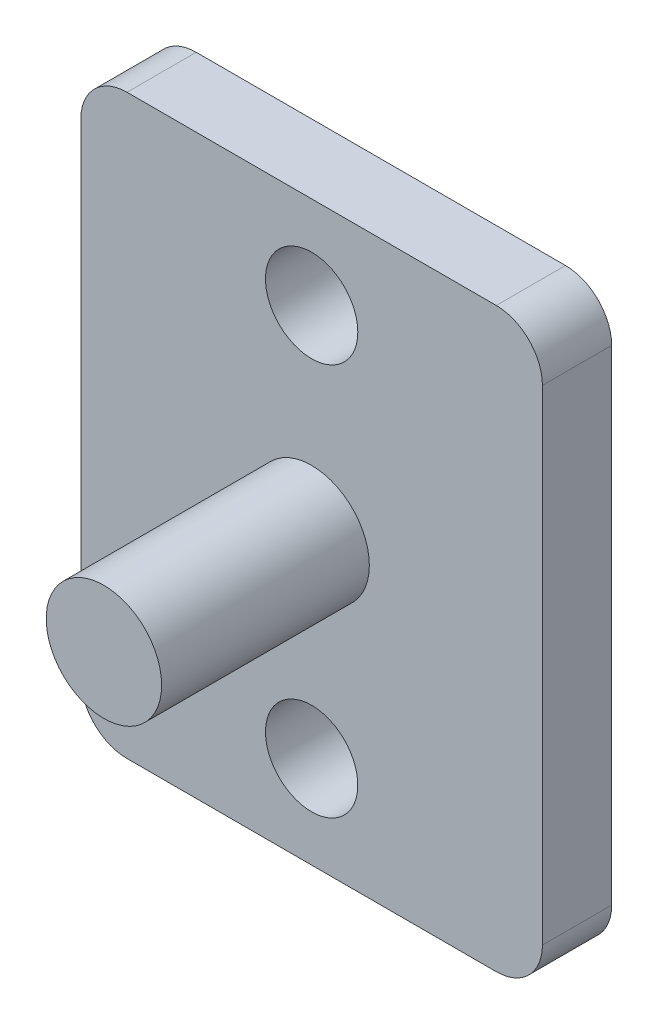
ISO-10303-21;
HEADER;
FILE_DESCRIPTION(('STEP AP214'),'2;1');
FILE_NAME('part.step','',(''),(''),'','','');
FILE_SCHEMA(('AUTOMOTIVE_DESIGN { 1 0 10303 214 1 1 1 1 }'));
ENDSEC;
DATA;
#1=APPLICATION_CONTEXT('core data for automotive mechanical design processes');
#2=APPLICATION_PROTOCOL_DEFINITION('international standard','automotive_design',2000,#1);
#3=PRODUCT_CONTEXT('',#1,'mechanical');
#4=PRODUCT('Part','Part','',(#3));
#5=PRODUCT_RELATED_PRODUCT_CATEGORY('part','',(#4));
#6=PRODUCT_DEFINITION_FORMATION('','',#4);
#7=PRODUCT_DEFINITION_CONTEXT('part definition',#1,'design');
#8=PRODUCT_DEFINITION('design','',#6,#7);
#9=PRODUCT_DEFINITION_SHAPE('','',#8);
#10=(LENGTH_UNIT() NAMED_UNIT(*) SI_UNIT(.MILLI.,.METRE.));
#11=(NAMED_UNIT(*) PLANE_ANGLE_UNIT() SI_UNIT($,.RADIAN.));
#12=(NAMED_UNIT(*) SI_UNIT($,.STERADIAN.) SOLID_ANGLE_UNIT());
#13=UNCERTAINTY_MEASURE_WITH_UNIT(LENGTH_MEASURE(1.E-05),#10,'distance_accuracy_value','');
#14=(GEOMETRIC_REPRESENTATION_CONTEXT(3) GLOBAL_UNCERTAINTY_ASSIGNED_CONTEXT((#13)) GLOBAL_UNIT_ASSIGNED_CONTEXT((#10,
#11,#12)) REPRESENTATION_CONTEXT('',''));
#15=CARTESIAN_POINT('',(0.,0.,0.));
#16=DIRECTION('',(0.,0.,1.));
#17=DIRECTION('',(1.,0.,0.));
#18=AXIS2_PLACEMENT_3D('',#15,#16,#17);
#19=CARTESIAN_POINT('',(0.,0.,3.));
#20=DIRECTION('',(0.,0.,1.));
#21=DIRECTION('',(1.,0.,0.));
#22=AXIS2_PLACEMENT_3D('',#19,#20,#21);
#23=PLANE('',#22);
#24=CARTESIAN_POINT('',(0.,0.,3.));
#25=DIRECTION('',(0.,0.,1.));
#26=DIRECTION('',(1.,0.,0.));
#27=AXIS2_PLACEMENT_3D('',#24,#25,#26);
#28=CIRCLE('',#27,2.5);
#29=CARTESIAN_POINT('',(2.5,0.,3.));
#30=VERTEX_POINT('',#29);
#31=EDGE_CURVE('E189',#30,#30,#28,.T.);
#32=ORIENTED_EDGE('',*,*,#31,.F.);
#33=EDGE_LOOP('',(#32));
#34=FACE_BOUND('',#33,.T.);
#35=CARTESIAN_POINT('',(0.,8.5,3.));
#36=DIRECTION('',(0.,0.,1.));
#37=DIRECTION('',(1.,0.,0.));
#38=AXIS2_PLACEMENT_3D('',#35,#36,#37);
#39=CIRCLE('',#38,2.);
#40=CARTESIAN_POINT('',(2.,8.5,3.));
#41=VERTEX_POINT('',#40);
#42=EDGE_CURVE('E132',#41,#41,#39,.T.);
#43=ORIENTED_EDGE('',*,*,#42,.F.);
#44=EDGE_LOOP('',(#43));
#45=FACE_BOUND('',#44,.T.);
#46=DIRECTION('',(0.,-1.,0.));
#47=VECTOR('',#46,1.);
#48=CARTESIAN_POINT('',(-10.,-12.5,3.));
#49=LINE('',#48,#47);
#50=CARTESIAN_POINT('',(-10.,10.5,3.));
#51=VERTEX_POINT('',#50);
#52=CARTESIAN_POINT('',(-10.,-10.5,3.));
#53=VERTEX_POINT('',#52);
#54=EDGE_CURVE('E137',#51,#53,#49,.T.);
#55=ORIENTED_EDGE('',*,*,#54,.T.);
#56=CARTESIAN_POINT('',(-8.,-10.5,3.));
#57=DIRECTION('',(0.,0.,1.));
#58=DIRECTION('',(1.,0.,0.));
#59=AXIS2_PLACEMENT_3D('',#56,#57,#58);
#60=CIRCLE('',#59,2.);
#61=CARTESIAN_POINT('',(-8.,-12.5,3.));
#62=VERTEX_POINT('',#61);
#63=EDGE_CURVE('E152',#53,#62,#60,.T.);
#64=ORIENTED_EDGE('',*,*,#63,.T.);
#65=DIRECTION('',(1.,0.,0.));
#66=VECTOR('',#65,1.);
#67=CARTESIAN_POINT('',(10.,-12.5,3.));
#68=LINE('',#67,#66);
#69=CARTESIAN_POINT('',(8.,-12.5,3.));
#70=VERTEX_POINT('',#69);
#71=EDGE_CURVE('E119',#62,#70,#68,.T.);
#72=ORIENTED_EDGE('',*,*,#71,.T.);
#73=CARTESIAN_POINT('',(8.,-10.5,3.));
#74=DIRECTION('',(0.,0.,1.));
#75=DIRECTION('',(1.,0.,0.));
#76=AXIS2_PLACEMENT_3D('',#73,#74,#75);
#77=CIRCLE('',#76,2.);
#78=CARTESIAN_POINT('',(10.,-10.5,3.));
#79=VERTEX_POINT('',#78);
#80=EDGE_CURVE('E150',#70,#79,#77,.T.);
#81=ORIENTED_EDGE('',*,*,#80,.T.);
#82=DIRECTION('',(0.,1.,0.));
#83=VECTOR('',#82,1.);
#84=CARTESIAN_POINT('',(10.,-12.5,3.));
#85=LINE('',#84,#83);
#86=CARTESIAN_POINT('',(10.,10.5,3.));
#87=VERTEX_POINT('',#86);
#88=EDGE_CURVE('E163',#79,#87,#85,.T.);
#89=ORIENTED_EDGE('',*,*,#88,.T.);
#90=CARTESIAN_POINT('',(8.,10.5,3.));
#91=DIRECTION('',(0.,0.,1.));
#92=DIRECTION('',(1.,0.,0.));
#93=AXIS2_PLACEMENT_3D('',#90,#91,#92);
#94=CIRCLE('',#93,2.);
#95=CARTESIAN_POINT('',(8.,12.5,3.));
#96=VERTEX_POINT('',#95);
#97=EDGE_CURVE('E54',#87,#96,#94,.T.);
#98=ORIENTED_EDGE('',*,*,#97,.T.);
#99=DIRECTION('',(-1.,0.,0.));
#100=VECTOR('',#99,1.);
#101=CARTESIAN_POINT('',(10.,12.5,3.));
#102=LINE('',#101,#100);
#103=CARTESIAN_POINT('',(-8.,12.5,3.));
#104=VERTEX_POINT('',#103);
#105=EDGE_CURVE('E138',#96,#104,#102,.T.);
#106=ORIENTED_EDGE('',*,*,#105,.T.);
#107=CARTESIAN_POINT('',(-8.,10.5,3.));
#108=DIRECTION('',(0.,0.,1.));
#109=DIRECTION('',(1.,0.,0.));
#110=AXIS2_PLACEMENT_3D('',#107,#108,#109);
#111=CIRCLE('',#110,2.);
#112=EDGE_CURVE('E147',#104,#51,#111,.T.);
#113=ORIENTED_EDGE('',*,*,#112,.T.);
#114=EDGE_LOOP('',(#55,#64,#72,#81,#89,#98,#106,#113));
#115=FACE_BOUND('',#114,.T.);
#116=CARTESIAN_POINT('',(0.,-8.5,3.));
#117=DIRECTION('',(0.,0.,1.));
#118=DIRECTION('',(-1.,0.,0.));
#119=AXIS2_PLACEMENT_3D('',#116,#117,#118);
#120=CIRCLE('',#119,2.);
#121=CARTESIAN_POINT('',(-2.,-8.5,3.));
#122=VERTEX_POINT('',#121);
#123=EDGE_CURVE('E180',#122,#122,#120,.T.);
#124=ORIENTED_EDGE('',*,*,#123,.F.);
#125=EDGE_LOOP('',(#124));
#126=FACE_BOUND('',#125,.T.);
#127=ADVANCED_FACE('F33',(#34,#45,#115,#126),#23,.T.);
#128=CARTESIAN_POINT('',(0.,0.,0.));
#129=DIRECTION('',(0.,0.,1.));
#130=DIRECTION('',(1.,0.,0.));
#131=AXIS2_PLACEMENT_3D('',#128,#129,#130);
#132=PLANE('',#131);
#133=DIRECTION('',(1.,0.,0.));
#134=VECTOR('',#133,1.);
#135=CARTESIAN_POINT('',(10.,-12.5,0.));
#136=LINE('',#135,#134);
#137=CARTESIAN_POINT('',(-8.,-12.5,0.));
#138=VERTEX_POINT('',#137);
#139=CARTESIAN_POINT('',(8.,-12.5,0.));
#140=VERTEX_POINT('',#139);
#141=EDGE_CURVE('E116',#138,#140,#136,.T.);
#142=ORIENTED_EDGE('',*,*,#141,.F.);
#143=CARTESIAN_POINT('',(-8.,-10.5,0.));
#144=DIRECTION('',(0.,0.,1.));
#145=DIRECTION('',(1.,0.,0.));
#146=AXIS2_PLACEMENT_3D('',#143,#144,#145);
#147=CIRCLE('',#146,2.);
#148=CARTESIAN_POINT('',(-10.,-10.5,0.));
#149=VERTEX_POINT('',#148);
#150=EDGE_CURVE('E99',#138,#149,#147,.F.);
#151=ORIENTED_EDGE('',*,*,#150,.T.);
#152=DIRECTION('',(0.,-1.,0.));
#153=VECTOR('',#152,1.);
#154=CARTESIAN_POINT('',(-10.,-12.5,0.));
#155=LINE('',#154,#153);
#156=CARTESIAN_POINT('',(-10.,10.5,0.));
#157=VERTEX_POINT('',#156);
#158=EDGE_CURVE('E127',#157,#149,#155,.T.);
#159=ORIENTED_EDGE('',*,*,#158,.F.);
#160=CARTESIAN_POINT('',(-8.,10.5,0.));
#161=DIRECTION('',(0.,0.,1.));
#162=DIRECTION('',(1.,0.,0.));
#163=AXIS2_PLACEMENT_3D('',#160,#161,#162);
#164=CIRCLE('',#163,2.);
#165=CARTESIAN_POINT('',(-8.,12.5,0.));
#166=VERTEX_POINT('',#165);
#167=EDGE_CURVE('E120',#157,#166,#164,.F.);
#168=ORIENTED_EDGE('',*,*,#167,.T.);
#169=DIRECTION('',(-1.,0.,0.));
#170=VECTOR('',#169,1.);
#171=CARTESIAN_POINT('',(10.,12.5,0.));
#172=LINE('',#171,#170);
#173=CARTESIAN_POINT('',(8.,12.5,0.));
#174=VERTEX_POINT('',#173);
#175=EDGE_CURVE('E130',#174,#166,#172,.T.);
#176=ORIENTED_EDGE('',*,*,#175,.F.);
#177=CARTESIAN_POINT('',(8.,10.5,0.));
#178=DIRECTION('',(0.,0.,1.));
#179=DIRECTION('',(1.,0.,0.));
#180=AXIS2_PLACEMENT_3D('',#177,#178,#179);
#181=CIRCLE('',#180,2.);
#182=CARTESIAN_POINT('',(10.,10.5,0.));
#183=VERTEX_POINT('',#182);
#184=EDGE_CURVE('E141',#174,#183,#181,.F.);
#185=ORIENTED_EDGE('',*,*,#184,.T.);
#186=DIRECTION('',(0.,1.,0.));
#187=VECTOR('',#186,1.);
#188=CARTESIAN_POINT('',(10.,-12.5,0.));
#189=LINE('',#188,#187);
#190=CARTESIAN_POINT('',(10.,-10.5,0.));
#191=VERTEX_POINT('',#190);
#192=EDGE_CURVE('E126',#191,#183,#189,.T.);
#193=ORIENTED_EDGE('',*,*,#192,.F.);
#194=CARTESIAN_POINT('',(8.,-10.5,0.));
#195=DIRECTION('',(0.,0.,1.));
#196=DIRECTION('',(1.,0.,0.));
#197=AXIS2_PLACEMENT_3D('',#194,#195,#196);
#198=CIRCLE('',#197,2.);
#199=EDGE_CURVE('E110',#191,#140,#198,.F.);
#200=ORIENTED_EDGE('',*,*,#199,.T.);
#201=EDGE_LOOP('',(#142,#151,#159,#168,#176,#185,#193,#200));
#202=FACE_BOUND('',#201,.T.);
#203=CARTESIAN_POINT('',(0.,8.5,0.));
#204=DIRECTION('',(0.,0.,1.));
#205=DIRECTION('',(1.,0.,0.));
#206=AXIS2_PLACEMENT_3D('',#203,#204,#205);
#207=CIRCLE('',#206,2.);
#208=CARTESIAN_POINT('',(2.,8.5,0.));
#209=VERTEX_POINT('',#208);
#210=EDGE_CURVE('E177',#209,#209,#207,.T.);
#211=ORIENTED_EDGE('',*,*,#210,.T.);
#212=EDGE_LOOP('',(#211));
#213=FACE_BOUND('',#212,.T.);
#214=CARTESIAN_POINT('',(0.,-8.5,0.));
#215=DIRECTION('',(0.,0.,1.));
#216=DIRECTION('',(-1.,0.,0.));
#217=AXIS2_PLACEMENT_3D('',#214,#215,#216);
#218=CIRCLE('',#217,2.);
#219=CARTESIAN_POINT('',(-2.,-8.5,0.));
#220=VERTEX_POINT('',#219);
#221=EDGE_CURVE('E183',#220,#220,#218,.T.);
#222=ORIENTED_EDGE('',*,*,#221,.T.);
#223=EDGE_LOOP('',(#222));
#224=FACE_BOUND('',#223,.T.);
#225=ADVANCED_FACE('F123',(#202,#213,#224),#132,.F.);
#226=CARTESIAN_POINT('',(-10.,-12.5,3.));
#227=DIRECTION('',(1.,0.,0.));
#228=DIRECTION('',(0.,0.,-1.));
#229=AXIS2_PLACEMENT_3D('',#226,#227,#228);
#230=PLANE('',#229);
#231=ORIENTED_EDGE('',*,*,#158,.T.);
#232=DIRECTION('',(0.,0.,-1.));
#233=VECTOR('',#232,1.);
#234=CARTESIAN_POINT('',(-10.,-10.5,3.));
#235=LINE('',#234,#233);
#236=EDGE_CURVE('E104',#149,#53,#235,.F.);
#237=ORIENTED_EDGE('',*,*,#236,.T.);
#238=ORIENTED_EDGE('',*,*,#54,.F.);
#239=DIRECTION('',(0.,0.,-1.));
#240=VECTOR('',#239,1.);
#241=CARTESIAN_POINT('',(-10.,10.5,3.));
#242=LINE('',#241,#240);
#243=EDGE_CURVE('E109',#51,#157,#242,.T.);
#244=ORIENTED_EDGE('',*,*,#243,.T.);
#245=EDGE_LOOP('',(#231,#237,#238,#244));
#246=FACE_BOUND('',#245,.T.);
#247=ADVANCED_FACE('F219',(#246),#230,.F.);
#248=CARTESIAN_POINT('',(10.,-12.5,3.));
#249=DIRECTION('',(0.,1.,0.));
#250=DIRECTION('',(-1.,0.,0.));
#251=AXIS2_PLACEMENT_3D('',#248,#249,#250);
#252=PLANE('',#251);
#253=ORIENTED_EDGE('',*,*,#71,.F.);
#254=DIRECTION('',(0.,0.,-1.));
#255=VECTOR('',#254,1.);
#256=CARTESIAN_POINT('',(-8.,-12.5,3.));
#257=LINE('',#256,#255);
#258=EDGE_CURVE('E103',#62,#138,#257,.T.);
#259=ORIENTED_EDGE('',*,*,#258,.T.);
#260=ORIENTED_EDGE('',*,*,#141,.T.);
#261=DIRECTION('',(0.,0.,-1.));
#262=VECTOR('',#261,1.);
#263=CARTESIAN_POINT('',(8.,-12.5,3.));
#264=LINE('',#263,#262);
#265=EDGE_CURVE('E121',#140,#70,#264,.F.);
#266=ORIENTED_EDGE('',*,*,#265,.T.);
#267=EDGE_LOOP('',(#253,#259,#260,#266));
#268=FACE_BOUND('',#267,.T.);
#269=ADVANCED_FACE('F115',(#268),#252,.F.);
#270=CARTESIAN_POINT('',(10.,-12.5,3.));
#271=DIRECTION('',(-1.,0.,0.));
#272=DIRECTION('',(0.,0.,1.));
#273=AXIS2_PLACEMENT_3D('',#270,#271,#272);
#274=PLANE('',#273);
#275=ORIENTED_EDGE('',*,*,#88,.F.);
#276=DIRECTION('',(0.,0.,-1.));
#277=VECTOR('',#276,1.);
#278=CARTESIAN_POINT('',(10.,-10.5,3.));
#279=LINE('',#278,#277);
#280=EDGE_CURVE('E156',#79,#191,#279,.T.);
#281=ORIENTED_EDGE('',*,*,#280,.T.);
#282=ORIENTED_EDGE('',*,*,#192,.T.);
#283=DIRECTION('',(0.,0.,-1.));
#284=VECTOR('',#283,1.);
#285=CARTESIAN_POINT('',(10.,10.5,3.));
#286=LINE('',#285,#284);
#287=EDGE_CURVE('E154',#183,#87,#286,.F.);
#288=ORIENTED_EDGE('',*,*,#287,.T.);
#289=EDGE_LOOP('',(#275,#281,#282,#288));
#290=FACE_BOUND('',#289,.T.);
#291=ADVANCED_FACE('F161',(#290),#274,.F.);
#292=CARTESIAN_POINT('',(10.,12.5,3.));
#293=DIRECTION('',(0.,-1.,0.));
#294=DIRECTION('',(1.,0.,0.));
#295=AXIS2_PLACEMENT_3D('',#292,#293,#294);
#296=PLANE('',#295);
#297=ORIENTED_EDGE('',*,*,#105,.F.);
#298=DIRECTION('',(0.,0.,-1.));
#299=VECTOR('',#298,1.);
#300=CARTESIAN_POINT('',(8.,12.5,3.));
#301=LINE('',#300,#299);
#302=EDGE_CURVE('E11',#96,#174,#301,.T.);
#303=ORIENTED_EDGE('',*,*,#302,.T.);
#304=ORIENTED_EDGE('',*,*,#175,.T.);
#305=DIRECTION('',(0.,0.,-1.));
#306=VECTOR('',#305,1.);
#307=CARTESIAN_POINT('',(-8.,12.5,3.));
#308=LINE('',#307,#306);
#309=EDGE_CURVE('E41',#166,#104,#308,.F.);
#310=ORIENTED_EDGE('',*,*,#309,.T.);
#311=EDGE_LOOP('',(#297,#303,#304,#310));
#312=FACE_BOUND('',#311,.T.);
#313=ADVANCED_FACE('F170',(#312),#296,.F.);
#314=CARTESIAN_POINT('',(0.,8.5,3.));
#315=DIRECTION('',(0.,0.,-1.));
#316=DIRECTION('',(-1.,0.,0.));
#317=AXIS2_PLACEMENT_3D('',#314,#315,#316);
#318=CYLINDRICAL_SURFACE('',#317,2.);
#319=ORIENTED_EDGE('',*,*,#42,.T.);
#320=EDGE_LOOP('',(#319));
#321=FACE_BOUND('',#320,.T.);
#322=ORIENTED_EDGE('',*,*,#210,.F.);
#323=EDGE_LOOP('',(#322));
#324=FACE_BOUND('',#323,.T.);
#325=ADVANCED_FACE('F214',(#321,#324),#318,.F.);
#326=CARTESIAN_POINT('',(0.,-8.5,3.));
#327=DIRECTION('',(0.,0.,-1.));
#328=DIRECTION('',(-1.,0.,0.));
#329=AXIS2_PLACEMENT_3D('',#326,#327,#328);
#330=CYLINDRICAL_SURFACE('',#329,2.);
#331=ORIENTED_EDGE('',*,*,#123,.T.);
#332=EDGE_LOOP('',(#331));
#333=FACE_BOUND('',#332,.T.);
#334=ORIENTED_EDGE('',*,*,#221,.F.);
#335=EDGE_LOOP('',(#334));
#336=FACE_BOUND('',#335,.T.);
#337=ADVANCED_FACE('F211',(#333,#336),#330,.F.);
#338=CARTESIAN_POINT('',(-8.,-10.5,3.));
#339=DIRECTION('',(0.,0.,-1.));
#340=DIRECTION('',(-1.,0.,0.));
#341=AXIS2_PLACEMENT_3D('',#338,#339,#340);
#342=CYLINDRICAL_SURFACE('',#341,2.);
#343=ORIENTED_EDGE('',*,*,#63,.F.);
#344=ORIENTED_EDGE('',*,*,#236,.F.);
#345=ORIENTED_EDGE('',*,*,#150,.F.);
#346=ORIENTED_EDGE('',*,*,#258,.F.);
#347=EDGE_LOOP('',(#343,#344,#345,#346));
#348=FACE_BOUND('',#347,.T.);
#349=ADVANCED_FACE('F102',(#348),#342,.T.);
#350=CARTESIAN_POINT('',(8.,-10.5,3.));
#351=DIRECTION('',(0.,0.,-1.));
#352=DIRECTION('',(-1.,0.,0.));
#353=AXIS2_PLACEMENT_3D('',#350,#351,#352);
#354=CYLINDRICAL_SURFACE('',#353,2.);
#355=ORIENTED_EDGE('',*,*,#80,.F.);
#356=ORIENTED_EDGE('',*,*,#265,.F.);
#357=ORIENTED_EDGE('',*,*,#199,.F.);
#358=ORIENTED_EDGE('',*,*,#280,.F.);
#359=EDGE_LOOP('',(#355,#356,#357,#358));
#360=FACE_BOUND('',#359,.T.);
#361=ADVANCED_FACE('F236',(#360),#354,.T.);
#362=CARTESIAN_POINT('',(8.,10.5,3.));
#363=DIRECTION('',(0.,0.,-1.));
#364=DIRECTION('',(-1.,0.,0.));
#365=AXIS2_PLACEMENT_3D('',#362,#363,#364);
#366=CYLINDRICAL_SURFACE('',#365,2.);
#367=ORIENTED_EDGE('',*,*,#97,.F.);
#368=ORIENTED_EDGE('',*,*,#287,.F.);
#369=ORIENTED_EDGE('',*,*,#184,.F.);
#370=ORIENTED_EDGE('',*,*,#302,.F.);
#371=EDGE_LOOP('',(#367,#368,#369,#370));
#372=FACE_BOUND('',#371,.T.);
#373=ADVANCED_FACE('F169',(#372),#366,.T.);
#374=CARTESIAN_POINT('',(-8.,10.5,3.));
#375=DIRECTION('',(0.,0.,-1.));
#376=DIRECTION('',(-1.,0.,0.));
#377=AXIS2_PLACEMENT_3D('',#374,#375,#376);
#378=CYLINDRICAL_SURFACE('',#377,2.);
#379=ORIENTED_EDGE('',*,*,#112,.F.);
#380=ORIENTED_EDGE('',*,*,#309,.F.);
#381=ORIENTED_EDGE('',*,*,#167,.F.);
#382=ORIENTED_EDGE('',*,*,#243,.F.);
#383=EDGE_LOOP('',(#379,#380,#381,#382));
#384=FACE_BOUND('',#383,.T.);
#385=ADVANCED_FACE('F35',(#384),#378,.T.);
#386=CARTESIAN_POINT('',(0.,0.,12.));
#387=DIRECTION('',(0.,0.,-1.));
#388=DIRECTION('',(-1.,0.,0.));
#389=AXIS2_PLACEMENT_3D('',#386,#387,#388);
#390=CYLINDRICAL_SURFACE('',#389,2.5);
#391=CARTESIAN_POINT('',(0.,0.,12.));
#392=DIRECTION('',(0.,0.,1.));
#393=DIRECTION('',(1.,0.,0.));
#394=AXIS2_PLACEMENT_3D('',#391,#392,#393);
#395=CIRCLE('',#394,2.5);
#396=CARTESIAN_POINT('',(2.5,0.,12.));
#397=VERTEX_POINT('',#396);
#398=EDGE_CURVE('E186',#397,#397,#395,.T.);
#399=ORIENTED_EDGE('',*,*,#398,.F.);
#400=EDGE_LOOP('',(#399));
#401=FACE_BOUND('',#400,.T.);
#402=ORIENTED_EDGE('',*,*,#31,.T.);
#403=EDGE_LOOP('',(#402));
#404=FACE_BOUND('',#403,.T.);
#405=ADVANCED_FACE('F197',(#401,#404),#390,.T.);
#406=CARTESIAN_POINT('',(0.,0.,12.));
#407=DIRECTION('',(0.,0.,1.));
#408=DIRECTION('',(1.,0.,0.));
#409=AXIS2_PLACEMENT_3D('',#406,#407,#408);
#410=PLANE('',#409);
#411=ORIENTED_EDGE('',*,*,#398,.T.);
#412=EDGE_LOOP('',(#411));
#413=FACE_BOUND('',#412,.T.);
#414=ADVANCED_FACE('F195',(#413),#410,.T.);
#415=CLOSED_SHELL('',(#127,#225,#247,#269,#291,#313,#325,#337,#349,#361,#373,#385,#405,#414));
#416=MANIFOLD_SOLID_BREP('B2',#415);
#417=ADVANCED_BREP_SHAPE_REPRESENTATION('',(#18,#416),#14);
#418=SHAPE_DEFINITION_REPRESENTATION(#9,#417);
ENDSEC;
END-ISO-10303-21;
